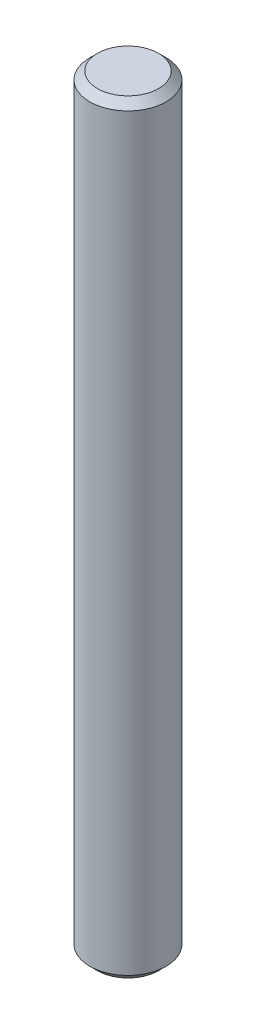
ISO-10303-21;
HEADER;
FILE_DESCRIPTION(('STEP AP214'),'2;1');
FILE_NAME('part.step','',(''),(''),'','','');
FILE_SCHEMA(('AUTOMOTIVE_DESIGN { 1 0 10303 214 1 1 1 1 }'));
ENDSEC;
DATA;
#1=APPLICATION_CONTEXT('core data for automotive mechanical design processes');
#2=APPLICATION_PROTOCOL_DEFINITION('international standard','automotive_design',2000,#1);
#3=PRODUCT_CONTEXT('',#1,'mechanical');
#4=PRODUCT('Part','Part','',(#3));
#5=PRODUCT_RELATED_PRODUCT_CATEGORY('part','',(#4));
#6=PRODUCT_DEFINITION_FORMATION('','',#4);
#7=PRODUCT_DEFINITION_CONTEXT('part definition',#1,'design');
#8=PRODUCT_DEFINITION('design','',#6,#7);
#9=PRODUCT_DEFINITION_SHAPE('','',#8);
#10=(LENGTH_UNIT() NAMED_UNIT(*) SI_UNIT(.MILLI.,.METRE.));
#11=(NAMED_UNIT(*) PLANE_ANGLE_UNIT() SI_UNIT($,.RADIAN.));
#12=(NAMED_UNIT(*) SI_UNIT($,.STERADIAN.) SOLID_ANGLE_UNIT());
#13=UNCERTAINTY_MEASURE_WITH_UNIT(LENGTH_MEASURE(1.E-05),#10,'distance_accuracy_value','');
#14=(GEOMETRIC_REPRESENTATION_CONTEXT(3) GLOBAL_UNCERTAINTY_ASSIGNED_CONTEXT((#13)) GLOBAL_UNIT_ASSIGNED_CONTEXT((#10,
#11,#12)) REPRESENTATION_CONTEXT('',''));
#15=CARTESIAN_POINT('',(0.,0.,0.));
#16=DIRECTION('',(0.,0.,1.));
#17=DIRECTION('',(1.,0.,0.));
#18=AXIS2_PLACEMENT_3D('',#15,#16,#17);
#19=CARTESIAN_POINT('',(0.,-50.,0.));
#20=DIRECTION('',(0.,1.,0.));
#21=DIRECTION('',(0.,0.,1.));
#22=AXIS2_PLACEMENT_3D('',#19,#20,#21);
#23=CYLINDRICAL_SURFACE('',#22,2.5);
#24=CARTESIAN_POINT('',(0.,-49.5,0.));
#25=DIRECTION('',(0.,1.,0.));
#26=DIRECTION('',(0.,0.,1.));
#27=AXIS2_PLACEMENT_3D('',#24,#25,#26);
#28=CIRCLE('',#27,2.5);
#29=CARTESIAN_POINT('',(0.,-49.5,2.5));
#30=VERTEX_POINT('',#29);
#31=EDGE_CURVE('E42',#30,#30,#28,.T.);
#32=ORIENTED_EDGE('',*,*,#31,.T.);
#33=EDGE_LOOP('',(#32));
#34=FACE_BOUND('',#33,.T.);
#35=CARTESIAN_POINT('',(0.,-0.500000000000007,0.));
#36=DIRECTION('',(0.,1.,0.));
#37=DIRECTION('',(0.,0.,1.));
#38=AXIS2_PLACEMENT_3D('',#35,#36,#37);
#39=CIRCLE('',#38,2.5);
#40=CARTESIAN_POINT('',(0.,-0.500000000000007,2.5));
#41=VERTEX_POINT('',#40);
#42=EDGE_CURVE('E46',#41,#41,#39,.F.);
#43=ORIENTED_EDGE('',*,*,#42,.T.);
#44=EDGE_LOOP('',(#43));
#45=FACE_BOUND('',#44,.T.);
#46=ADVANCED_FACE('F31',(#34,#45),#23,.T.);
#47=CARTESIAN_POINT('',(0.,-50.,0.));
#48=DIRECTION('',(0.,1.,0.));
#49=DIRECTION('',(0.,0.,1.));
#50=AXIS2_PLACEMENT_3D('',#47,#48,#49);
#51=PLANE('',#50);
#52=CARTESIAN_POINT('',(0.,-50.,0.));
#53=DIRECTION('',(0.,1.,0.));
#54=DIRECTION('',(0.,0.,1.));
#55=AXIS2_PLACEMENT_3D('',#52,#53,#54);
#56=CIRCLE('',#55,2.);
#57=CARTESIAN_POINT('',(0.,-50.,2.));
#58=VERTEX_POINT('',#57);
#59=EDGE_CURVE('E38',#58,#58,#56,.F.);
#60=ORIENTED_EDGE('',*,*,#59,.T.);
#61=EDGE_LOOP('',(#60));
#62=FACE_BOUND('',#61,.T.);
#63=ADVANCED_FACE('F62',(#62),#51,.F.);
#64=CARTESIAN_POINT('',(0.,0.,0.));
#65=DIRECTION('',(0.,1.,0.));
#66=DIRECTION('',(0.,0.,1.));
#67=AXIS2_PLACEMENT_3D('',#64,#65,#66);
#68=PLANE('',#67);
#69=CARTESIAN_POINT('',(0.,0.,0.));
#70=DIRECTION('',(0.,1.,0.));
#71=DIRECTION('',(0.,0.,1.));
#72=AXIS2_PLACEMENT_3D('',#69,#70,#71);
#73=CIRCLE('',#72,1.99999999999999);
#74=CARTESIAN_POINT('',(0.,0.,1.99999999999999));
#75=VERTEX_POINT('',#74);
#76=EDGE_CURVE('E10',#75,#75,#73,.T.);
#77=ORIENTED_EDGE('',*,*,#76,.T.);
#78=EDGE_LOOP('',(#77));
#79=FACE_BOUND('',#78,.T.);
#80=ADVANCED_FACE('F59',(#79),#68,.T.);
#81=CARTESIAN_POINT('',(0.,-49.5,0.));
#82=DIRECTION('',(0.,1.,0.));
#83=DIRECTION('',(0.,0.,1.));
#84=AXIS2_PLACEMENT_3D('',#81,#82,#83);
#85=CONICAL_SURFACE('',#84,2.5,0.785398163397446);
#86=ORIENTED_EDGE('',*,*,#59,.F.);
#87=EDGE_LOOP('',(#86));
#88=FACE_BOUND('',#87,.T.);
#89=ORIENTED_EDGE('',*,*,#31,.F.);
#90=EDGE_LOOP('',(#89));
#91=FACE_BOUND('',#90,.T.);
#92=ADVANCED_FACE('F55',(#88,#91),#85,.T.);
#93=CARTESIAN_POINT('',(0.,0.,0.));
#94=DIRECTION('',(0.,-1.,0.));
#95=DIRECTION('',(0.,0.,-1.));
#96=AXIS2_PLACEMENT_3D('',#93,#94,#95);
#97=CONICAL_SURFACE('',#96,1.99999999999999,0.785398163397446);
#98=ORIENTED_EDGE('',*,*,#42,.F.);
#99=EDGE_LOOP('',(#98));
#100=FACE_BOUND('',#99,.T.);
#101=ORIENTED_EDGE('',*,*,#76,.F.);
#102=EDGE_LOOP('',(#101));
#103=FACE_BOUND('',#102,.T.);
#104=ADVANCED_FACE('F33',(#100,#103),#97,.T.);
#105=CLOSED_SHELL('',(#46,#63,#80,#92,#104));
#106=MANIFOLD_SOLID_BREP('B2',#105);
#107=ADVANCED_BREP_SHAPE_REPRESENTATION('',(#18,#106),#14);
#108=SHAPE_DEFINITION_REPRESENTATION(#9,#107);
ENDSEC;
END-ISO-10303-21;
